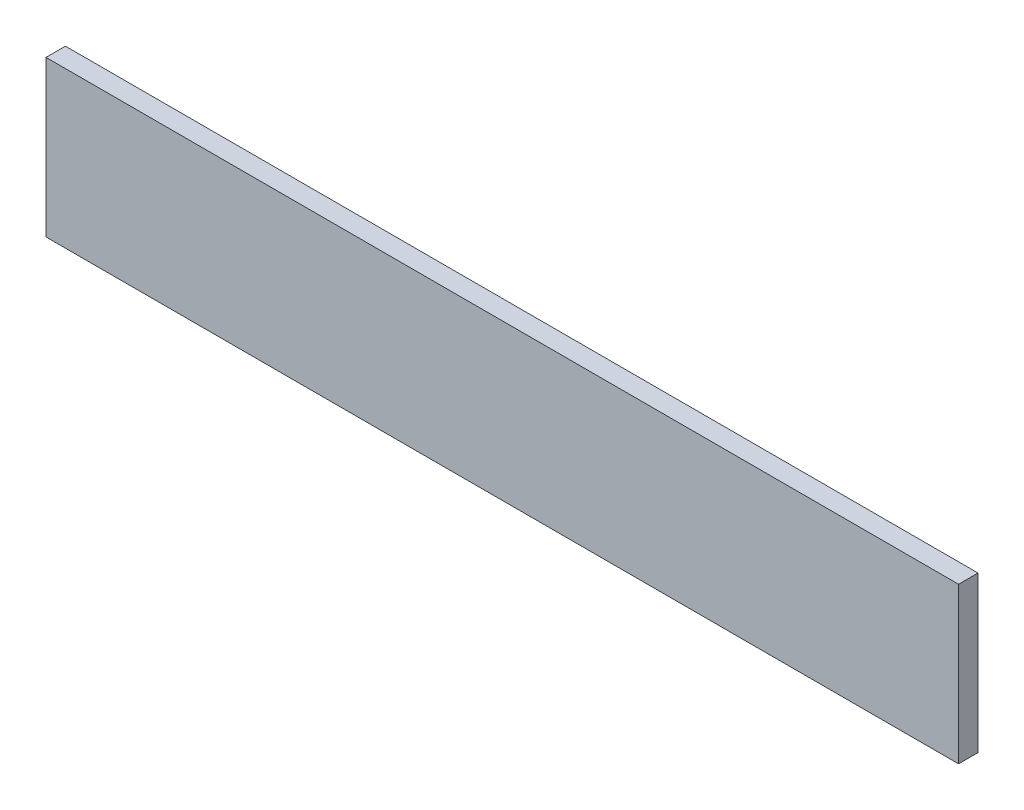
ISO-10303-21;
HEADER;
FILE_DESCRIPTION(('STEP AP214'),'2;1');
FILE_NAME('part.step','',(''),(''),'','','');
FILE_SCHEMA(('AUTOMOTIVE_DESIGN { 1 0 10303 214 1 1 1 1 }'));
ENDSEC;
DATA;
#1=APPLICATION_CONTEXT('core data for automotive mechanical design processes');
#2=APPLICATION_PROTOCOL_DEFINITION('international standard','automotive_design',2000,#1);
#3=PRODUCT_CONTEXT('',#1,'mechanical');
#4=PRODUCT('Part','Part','',(#3));
#5=PRODUCT_RELATED_PRODUCT_CATEGORY('part','',(#4));
#6=PRODUCT_DEFINITION_FORMATION('','',#4);
#7=PRODUCT_DEFINITION_CONTEXT('part definition',#1,'design');
#8=PRODUCT_DEFINITION('design','',#6,#7);
#9=PRODUCT_DEFINITION_SHAPE('','',#8);
#10=(LENGTH_UNIT() NAMED_UNIT(*) SI_UNIT(.MILLI.,.METRE.));
#11=(NAMED_UNIT(*) PLANE_ANGLE_UNIT() SI_UNIT($,.RADIAN.));
#12=(NAMED_UNIT(*) SI_UNIT($,.STERADIAN.) SOLID_ANGLE_UNIT());
#13=UNCERTAINTY_MEASURE_WITH_UNIT(LENGTH_MEASURE(1.E-05),#10,'distance_accuracy_value','');
#14=(GEOMETRIC_REPRESENTATION_CONTEXT(3) GLOBAL_UNCERTAINTY_ASSIGNED_CONTEXT((#13)) GLOBAL_UNIT_ASSIGNED_CONTEXT((#10,
#11,#12)) REPRESENTATION_CONTEXT('',''));
#15=CARTESIAN_POINT('',(0.,0.,0.));
#16=DIRECTION('',(0.,0.,1.));
#17=DIRECTION('',(1.,0.,0.));
#18=AXIS2_PLACEMENT_3D('',#15,#16,#17);
#19=CARTESIAN_POINT('',(352.,60.,15.));
#20=DIRECTION('',(-1.,0.,0.));
#21=DIRECTION('',(0.,0.,1.));
#22=AXIS2_PLACEMENT_3D('',#19,#20,#21);
#23=PLANE('',#22);
#24=DIRECTION('',(0.,1.,0.));
#25=VECTOR('',#24,1.);
#26=CARTESIAN_POINT('',(352.,60.,0.));
#27=LINE('',#26,#25);
#28=CARTESIAN_POINT('',(352.,-60.,0.));
#29=VERTEX_POINT('',#28);
#30=CARTESIAN_POINT('',(352.,60.,0.));
#31=VERTEX_POINT('',#30);
#32=EDGE_CURVE('E104',#29,#31,#27,.T.);
#33=ORIENTED_EDGE('',*,*,#32,.T.);
#34=DIRECTION('',(0.,0.,-1.));
#35=VECTOR('',#34,1.);
#36=CARTESIAN_POINT('',(352.,60.,15.));
#37=LINE('',#36,#35);
#38=CARTESIAN_POINT('',(352.,60.,15.));
#39=VERTEX_POINT('',#38);
#40=EDGE_CURVE('E11',#39,#31,#37,.T.);
#41=ORIENTED_EDGE('',*,*,#40,.F.);
#42=DIRECTION('',(0.,1.,0.));
#43=VECTOR('',#42,1.);
#44=CARTESIAN_POINT('',(352.,60.,15.));
#45=LINE('',#44,#43);
#46=CARTESIAN_POINT('',(352.,-60.,15.));
#47=VERTEX_POINT('',#46);
#48=EDGE_CURVE('E92',#47,#39,#45,.T.);
#49=ORIENTED_EDGE('',*,*,#48,.F.);
#50=DIRECTION('',(0.,0.,-1.));
#51=VECTOR('',#50,1.);
#52=CARTESIAN_POINT('',(352.,-60.,15.));
#53=LINE('',#52,#51);
#54=EDGE_CURVE('E100',#47,#29,#53,.T.);
#55=ORIENTED_EDGE('',*,*,#54,.T.);
#56=EDGE_LOOP('',(#33,#41,#49,#55));
#57=FACE_BOUND('',#56,.T.);
#58=ADVANCED_FACE('F41',(#57),#23,.F.);
#59=CARTESIAN_POINT('',(-352.,60.,15.));
#60=DIRECTION('',(0.,-1.,0.));
#61=DIRECTION('',(0.,0.,-1.));
#62=AXIS2_PLACEMENT_3D('',#59,#60,#61);
#63=PLANE('',#62);
#64=DIRECTION('',(-1.,0.,0.));
#65=VECTOR('',#64,1.);
#66=CARTESIAN_POINT('',(-352.,60.,0.));
#67=LINE('',#66,#65);
#68=CARTESIAN_POINT('',(-352.,60.,0.));
#69=VERTEX_POINT('',#68);
#70=EDGE_CURVE('E96',#31,#69,#67,.T.);
#71=ORIENTED_EDGE('',*,*,#70,.T.);
#72=DIRECTION('',(0.,0.,-1.));
#73=VECTOR('',#72,1.);
#74=CARTESIAN_POINT('',(-352.,60.,15.));
#75=LINE('',#74,#73);
#76=CARTESIAN_POINT('',(-352.,60.,15.));
#77=VERTEX_POINT('',#76);
#78=EDGE_CURVE('E49',#77,#69,#75,.T.);
#79=ORIENTED_EDGE('',*,*,#78,.F.);
#80=DIRECTION('',(-1.,0.,0.));
#81=VECTOR('',#80,1.);
#82=CARTESIAN_POINT('',(-352.,60.,15.));
#83=LINE('',#82,#81);
#84=EDGE_CURVE('E87',#39,#77,#83,.T.);
#85=ORIENTED_EDGE('',*,*,#84,.F.);
#86=ORIENTED_EDGE('',*,*,#40,.T.);
#87=EDGE_LOOP('',(#71,#79,#85,#86));
#88=FACE_BOUND('',#87,.T.);
#89=ADVANCED_FACE('F95',(#88),#63,.F.);
#90=CARTESIAN_POINT('',(-352.,60.,15.));
#91=DIRECTION('',(1.,0.,0.));
#92=DIRECTION('',(0.,0.,-1.));
#93=AXIS2_PLACEMENT_3D('',#90,#91,#92);
#94=PLANE('',#93);
#95=DIRECTION('',(0.,-1.,0.));
#96=VECTOR('',#95,1.);
#97=CARTESIAN_POINT('',(-352.,60.,0.));
#98=LINE('',#97,#96);
#99=CARTESIAN_POINT('',(-352.,-60.,0.));
#100=VERTEX_POINT('',#99);
#101=EDGE_CURVE('E74',#69,#100,#98,.T.);
#102=ORIENTED_EDGE('',*,*,#101,.T.);
#103=DIRECTION('',(0.,0.,-1.));
#104=VECTOR('',#103,1.);
#105=CARTESIAN_POINT('',(-352.,-60.,15.));
#106=LINE('',#105,#104);
#107=CARTESIAN_POINT('',(-352.,-60.,15.));
#108=VERTEX_POINT('',#107);
#109=EDGE_CURVE('E97',#108,#100,#106,.T.);
#110=ORIENTED_EDGE('',*,*,#109,.F.);
#111=DIRECTION('',(0.,-1.,0.));
#112=VECTOR('',#111,1.);
#113=CARTESIAN_POINT('',(-352.,60.,15.));
#114=LINE('',#113,#112);
#115=EDGE_CURVE('E90',#77,#108,#114,.T.);
#116=ORIENTED_EDGE('',*,*,#115,.F.);
#117=ORIENTED_EDGE('',*,*,#78,.T.);
#118=EDGE_LOOP('',(#102,#110,#116,#117));
#119=FACE_BOUND('',#118,.T.);
#120=ADVANCED_FACE('F98',(#119),#94,.F.);
#121=CARTESIAN_POINT('',(-352.,-60.,15.));
#122=DIRECTION('',(0.,1.,0.));
#123=DIRECTION('',(0.,0.,1.));
#124=AXIS2_PLACEMENT_3D('',#121,#122,#123);
#125=PLANE('',#124);
#126=DIRECTION('',(1.,0.,0.));
#127=VECTOR('',#126,1.);
#128=CARTESIAN_POINT('',(-352.,-60.,0.));
#129=LINE('',#128,#127);
#130=EDGE_CURVE('E80',#100,#29,#129,.T.);
#131=ORIENTED_EDGE('',*,*,#130,.T.);
#132=ORIENTED_EDGE('',*,*,#54,.F.);
#133=DIRECTION('',(1.,0.,0.));
#134=VECTOR('',#133,1.);
#135=CARTESIAN_POINT('',(-352.,-60.,15.));
#136=LINE('',#135,#134);
#137=EDGE_CURVE('E57',#108,#47,#136,.T.);
#138=ORIENTED_EDGE('',*,*,#137,.F.);
#139=ORIENTED_EDGE('',*,*,#109,.T.);
#140=EDGE_LOOP('',(#131,#132,#138,#139));
#141=FACE_BOUND('',#140,.T.);
#142=ADVANCED_FACE('F111',(#141),#125,.F.);
#143=CARTESIAN_POINT('',(0.,0.,15.));
#144=DIRECTION('',(0.,0.,1.));
#145=DIRECTION('',(1.,0.,0.));
#146=AXIS2_PLACEMENT_3D('',#143,#144,#145);
#147=PLANE('',#146);
#148=ORIENTED_EDGE('',*,*,#48,.T.);
#149=ORIENTED_EDGE('',*,*,#84,.T.);
#150=ORIENTED_EDGE('',*,*,#115,.T.);
#151=ORIENTED_EDGE('',*,*,#137,.T.);
#152=EDGE_LOOP('',(#148,#149,#150,#151));
#153=FACE_BOUND('',#152,.T.);
#154=ADVANCED_FACE('F88',(#153),#147,.T.);
#155=CARTESIAN_POINT('',(0.,0.,0.));
#156=DIRECTION('',(0.,0.,1.));
#157=DIRECTION('',(1.,0.,0.));
#158=AXIS2_PLACEMENT_3D('',#155,#156,#157);
#159=PLANE('',#158);
#160=ORIENTED_EDGE('',*,*,#32,.F.);
#161=ORIENTED_EDGE('',*,*,#130,.F.);
#162=ORIENTED_EDGE('',*,*,#101,.F.);
#163=ORIENTED_EDGE('',*,*,#70,.F.);
#164=EDGE_LOOP('',(#160,#161,#162,#163));
#165=FACE_BOUND('',#164,.T.);
#166=ADVANCED_FACE('F114',(#165),#159,.F.);
#167=CLOSED_SHELL('',(#58,#89,#120,#142,#154,#166));
#168=MANIFOLD_SOLID_BREP('B2',#167);
#169=ADVANCED_BREP_SHAPE_REPRESENTATION('',(#18,#168),#14);
#170=SHAPE_DEFINITION_REPRESENTATION(#9,#169);
ENDSEC;
END-ISO-10303-21;
